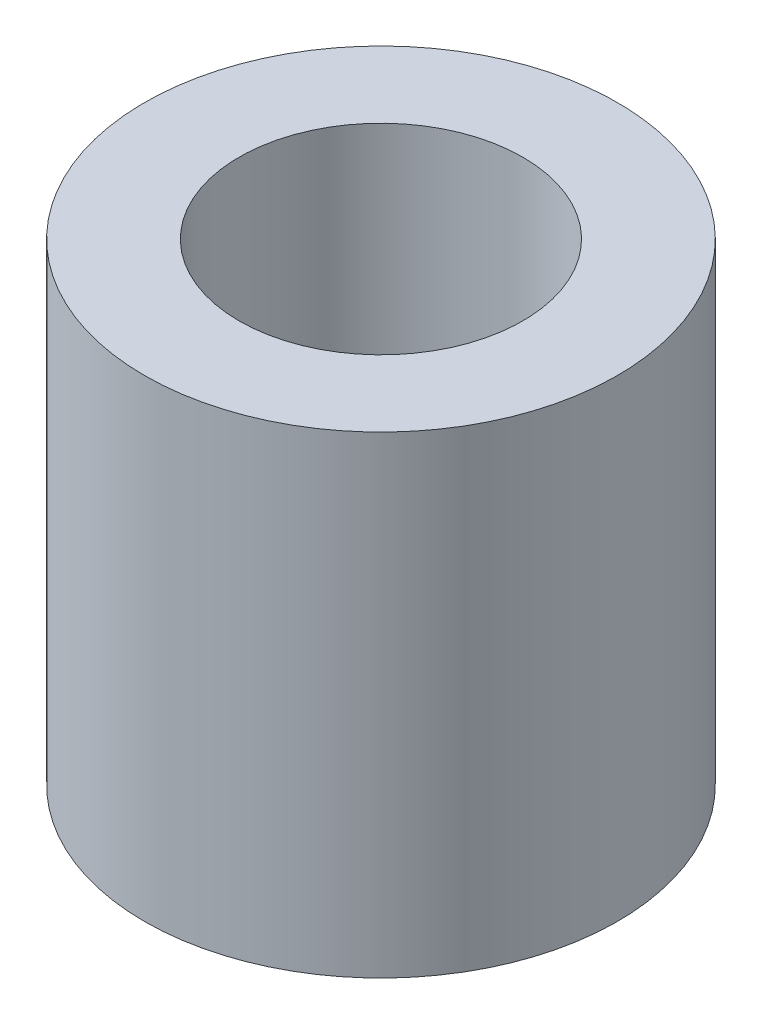
ISO-10303-21;
HEADER;
FILE_DESCRIPTION(('STEP AP214'),'2;1');
FILE_NAME('part.step','',(''),(''),'','','');
FILE_SCHEMA(('AUTOMOTIVE_DESIGN { 1 0 10303 214 1 1 1 1 }'));
ENDSEC;
DATA;
#1=APPLICATION_CONTEXT('core data for automotive mechanical design processes');
#2=APPLICATION_PROTOCOL_DEFINITION('international standard','automotive_design',2000,#1);
#3=PRODUCT_CONTEXT('',#1,'mechanical');
#4=PRODUCT('Part','Part','',(#3));
#5=PRODUCT_RELATED_PRODUCT_CATEGORY('part','',(#4));
#6=PRODUCT_DEFINITION_FORMATION('','',#4);
#7=PRODUCT_DEFINITION_CONTEXT('part definition',#1,'design');
#8=PRODUCT_DEFINITION('design','',#6,#7);
#9=PRODUCT_DEFINITION_SHAPE('','',#8);
#10=(LENGTH_UNIT() NAMED_UNIT(*) SI_UNIT(.MILLI.,.METRE.));
#11=(NAMED_UNIT(*) PLANE_ANGLE_UNIT() SI_UNIT($,.RADIAN.));
#12=(NAMED_UNIT(*) SI_UNIT($,.STERADIAN.) SOLID_ANGLE_UNIT());
#13=UNCERTAINTY_MEASURE_WITH_UNIT(LENGTH_MEASURE(1.E-05),#10,'distance_accuracy_value','');
#14=(GEOMETRIC_REPRESENTATION_CONTEXT(3) GLOBAL_UNCERTAINTY_ASSIGNED_CONTEXT((#13)) GLOBAL_UNIT_ASSIGNED_CONTEXT((#10,
#11,#12)) REPRESENTATION_CONTEXT('',''));
#15=CARTESIAN_POINT('',(0.,0.,0.));
#16=DIRECTION('',(0.,0.,1.));
#17=DIRECTION('',(1.,0.,0.));
#18=AXIS2_PLACEMENT_3D('',#15,#16,#17);
#19=CARTESIAN_POINT('',(0.,5.,0.));
#20=DIRECTION('',(0.,1.,0.));
#21=DIRECTION('',(0.,0.,1.));
#22=AXIS2_PLACEMENT_3D('',#19,#20,#21);
#23=PLANE('',#22);
#24=CARTESIAN_POINT('',(0.,5.,0.));
#25=DIRECTION('',(0.,1.,0.));
#26=DIRECTION('',(0.,0.,1.));
#27=AXIS2_PLACEMENT_3D('',#24,#25,#26);
#28=CIRCLE('',#27,2.5);
#29=CARTESIAN_POINT('',(0.,5.,2.5));
#30=VERTEX_POINT('',#29);
#31=EDGE_CURVE('E10',#30,#30,#28,.T.);
#32=ORIENTED_EDGE('',*,*,#31,.T.);
#33=EDGE_LOOP('',(#32));
#34=FACE_BOUND('',#33,.T.);
#35=CARTESIAN_POINT('',(0.,5.,0.));
#36=DIRECTION('',(0.,1.,0.));
#37=DIRECTION('',(0.,0.,1.));
#38=AXIS2_PLACEMENT_3D('',#35,#36,#37);
#39=CIRCLE('',#38,1.5);
#40=CARTESIAN_POINT('',(0.,5.,1.5));
#41=VERTEX_POINT('',#40);
#42=EDGE_CURVE('E41',#41,#41,#39,.T.);
#43=ORIENTED_EDGE('',*,*,#42,.F.);
#44=EDGE_LOOP('',(#43));
#45=FACE_BOUND('',#44,.T.);
#46=ADVANCED_FACE('F30',(#34,#45),#23,.T.);
#47=CARTESIAN_POINT('',(0.,0.,0.));
#48=DIRECTION('',(0.,1.,0.));
#49=DIRECTION('',(0.,0.,1.));
#50=AXIS2_PLACEMENT_3D('',#47,#48,#49);
#51=PLANE('',#50);
#52=CARTESIAN_POINT('',(0.,0.,0.));
#53=DIRECTION('',(0.,1.,0.));
#54=DIRECTION('',(0.,0.,1.));
#55=AXIS2_PLACEMENT_3D('',#52,#53,#54);
#56=CIRCLE('',#55,2.5);
#57=CARTESIAN_POINT('',(0.,0.,2.5));
#58=VERTEX_POINT('',#57);
#59=EDGE_CURVE('E34',#58,#58,#56,.T.);
#60=ORIENTED_EDGE('',*,*,#59,.F.);
#61=EDGE_LOOP('',(#60));
#62=FACE_BOUND('',#61,.T.);
#63=CARTESIAN_POINT('',(0.,0.,0.));
#64=DIRECTION('',(0.,1.,0.));
#65=DIRECTION('',(0.,0.,1.));
#66=AXIS2_PLACEMENT_3D('',#63,#64,#65);
#67=CIRCLE('',#66,1.5);
#68=CARTESIAN_POINT('',(0.,0.,1.5));
#69=VERTEX_POINT('',#68);
#70=EDGE_CURVE('E43',#69,#69,#67,.T.);
#71=ORIENTED_EDGE('',*,*,#70,.T.);
#72=EDGE_LOOP('',(#71));
#73=FACE_BOUND('',#72,.T.);
#74=ADVANCED_FACE('F53',(#62,#73),#51,.F.);
#75=CARTESIAN_POINT('',(0.,5.,0.));
#76=DIRECTION('',(0.,-1.,0.));
#77=DIRECTION('',(0.,0.,-1.));
#78=AXIS2_PLACEMENT_3D('',#75,#76,#77);
#79=CYLINDRICAL_SURFACE('',#78,2.5);
#80=ORIENTED_EDGE('',*,*,#31,.F.);
#81=EDGE_LOOP('',(#80));
#82=FACE_BOUND('',#81,.T.);
#83=ORIENTED_EDGE('',*,*,#59,.T.);
#84=EDGE_LOOP('',(#83));
#85=FACE_BOUND('',#84,.T.);
#86=ADVANCED_FACE('F32',(#82,#85),#79,.T.);
#87=CARTESIAN_POINT('',(0.,5.,0.));
#88=DIRECTION('',(0.,-1.,0.));
#89=DIRECTION('',(0.,0.,-1.));
#90=AXIS2_PLACEMENT_3D('',#87,#88,#89);
#91=CYLINDRICAL_SURFACE('',#90,1.5);
#92=ORIENTED_EDGE('',*,*,#42,.T.);
#93=EDGE_LOOP('',(#92));
#94=FACE_BOUND('',#93,.T.);
#95=ORIENTED_EDGE('',*,*,#70,.F.);
#96=EDGE_LOOP('',(#95));
#97=FACE_BOUND('',#96,.T.);
#98=ADVANCED_FACE('F49',(#94,#97),#91,.F.);
#99=CLOSED_SHELL('',(#46,#74,#86,#98));
#100=MANIFOLD_SOLID_BREP('B2',#99);
#101=ADVANCED_BREP_SHAPE_REPRESENTATION('',(#18,#100),#14);
#102=SHAPE_DEFINITION_REPRESENTATION(#9,#101);
ENDSEC;
END-ISO-10303-21;
